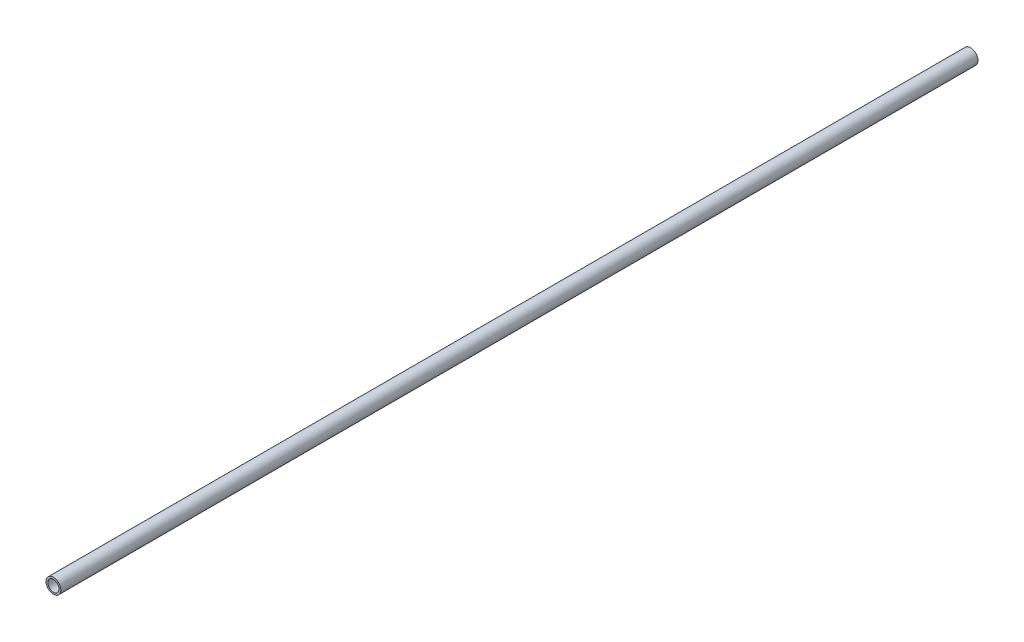
ISO-10303-21;
HEADER;
FILE_DESCRIPTION(('STEP AP214'),'2;1');
FILE_NAME('part.step','',(''),(''),'','','');
FILE_SCHEMA(('AUTOMOTIVE_DESIGN { 1 0 10303 214 1 1 1 1 }'));
ENDSEC;
DATA;
#1=APPLICATION_CONTEXT('core data for automotive mechanical design processes');
#2=APPLICATION_PROTOCOL_DEFINITION('international standard','automotive_design',2000,#1);
#3=PRODUCT_CONTEXT('',#1,'mechanical');
#4=PRODUCT('Part','Part','',(#3));
#5=PRODUCT_RELATED_PRODUCT_CATEGORY('part','',(#4));
#6=PRODUCT_DEFINITION_FORMATION('','',#4);
#7=PRODUCT_DEFINITION_CONTEXT('part definition',#1,'design');
#8=PRODUCT_DEFINITION('design','',#6,#7);
#9=PRODUCT_DEFINITION_SHAPE('','',#8);
#10=(LENGTH_UNIT() NAMED_UNIT(*) SI_UNIT(.MILLI.,.METRE.));
#11=(NAMED_UNIT(*) PLANE_ANGLE_UNIT() SI_UNIT($,.RADIAN.));
#12=(NAMED_UNIT(*) SI_UNIT($,.STERADIAN.) SOLID_ANGLE_UNIT());
#13=UNCERTAINTY_MEASURE_WITH_UNIT(LENGTH_MEASURE(1.E-05),#10,'distance_accuracy_value','');
#14=(GEOMETRIC_REPRESENTATION_CONTEXT(3) GLOBAL_UNCERTAINTY_ASSIGNED_CONTEXT((#13)) GLOBAL_UNIT_ASSIGNED_CONTEXT((#10,
#11,#12)) REPRESENTATION_CONTEXT('',''));
#15=CARTESIAN_POINT('',(0.,0.,0.));
#16=DIRECTION('',(0.,0.,1.));
#17=DIRECTION('',(1.,0.,0.));
#18=AXIS2_PLACEMENT_3D('',#15,#16,#17);
#19=CARTESIAN_POINT('',(-6.8052618233913,9.03698539207017,247.65));
#20=DIRECTION('',(0.,0.,1.));
#21=DIRECTION('',(1.,0.,0.));
#22=AXIS2_PLACEMENT_3D('',#19,#20,#21);
#23=PLANE('',#22);
#24=CARTESIAN_POINT('',(-6.8052618233913,9.03698539207017,247.65));
#25=DIRECTION('',(0.,0.,1.));
#26=DIRECTION('',(1.,0.,0.));
#27=AXIS2_PLACEMENT_3D('',#24,#25,#26);
#28=CIRCLE('',#27,2.);
#29=CARTESIAN_POINT('',(-4.80526182339129,9.03698539207017,247.65));
#30=VERTEX_POINT('',#29);
#31=EDGE_CURVE('E10',#30,#30,#28,.T.);
#32=ORIENTED_EDGE('',*,*,#31,.T.);
#33=EDGE_LOOP('',(#32));
#34=FACE_BOUND('',#33,.T.);
#35=CARTESIAN_POINT('',(-6.8052618233913,9.03698539207017,247.65));
#36=DIRECTION('',(0.,0.,1.));
#37=DIRECTION('',(1.,0.,0.));
#38=AXIS2_PLACEMENT_3D('',#35,#36,#37);
#39=CIRCLE('',#38,1.5);
#40=CARTESIAN_POINT('',(-5.30526182339129,9.03698539207017,247.65));
#41=VERTEX_POINT('',#40);
#42=EDGE_CURVE('E50',#41,#41,#39,.T.);
#43=ORIENTED_EDGE('',*,*,#42,.F.);
#44=EDGE_LOOP('',(#43));
#45=FACE_BOUND('',#44,.T.);
#46=ADVANCED_FACE('F37',(#34,#45),#23,.T.);
#47=CARTESIAN_POINT('',(-6.8052618233913,9.03698539207017,0.));
#48=DIRECTION('',(0.,0.,1.));
#49=DIRECTION('',(1.,0.,0.));
#50=AXIS2_PLACEMENT_3D('',#47,#48,#49);
#51=PLANE('',#50);
#52=CARTESIAN_POINT('',(-6.8052618233913,9.03698539207017,0.));
#53=DIRECTION('',(0.,0.,1.));
#54=DIRECTION('',(1.,0.,0.));
#55=AXIS2_PLACEMENT_3D('',#52,#53,#54);
#56=CIRCLE('',#55,2.);
#57=CARTESIAN_POINT('',(-4.80526182339129,9.03698539207017,0.));
#58=VERTEX_POINT('',#57);
#59=EDGE_CURVE('E41',#58,#58,#56,.T.);
#60=ORIENTED_EDGE('',*,*,#59,.F.);
#61=EDGE_LOOP('',(#60));
#62=FACE_BOUND('',#61,.T.);
#63=CARTESIAN_POINT('',(-6.8052618233913,9.03698539207017,0.));
#64=DIRECTION('',(0.,0.,1.));
#65=DIRECTION('',(1.,0.,0.));
#66=AXIS2_PLACEMENT_3D('',#63,#64,#65);
#67=CIRCLE('',#66,1.5);
#68=CARTESIAN_POINT('',(-5.30526182339129,9.03698539207017,0.));
#69=VERTEX_POINT('',#68);
#70=EDGE_CURVE('E52',#69,#69,#67,.T.);
#71=ORIENTED_EDGE('',*,*,#70,.T.);
#72=EDGE_LOOP('',(#71));
#73=FACE_BOUND('',#72,.T.);
#74=ADVANCED_FACE('F64',(#62,#73),#51,.F.);
#75=CARTESIAN_POINT('',(-6.8052618233913,9.03698539207017,247.65));
#76=DIRECTION('',(0.,0.,-1.));
#77=DIRECTION('',(-1.,0.,0.));
#78=AXIS2_PLACEMENT_3D('',#75,#76,#77);
#79=CYLINDRICAL_SURFACE('',#78,2.);
#80=ORIENTED_EDGE('',*,*,#31,.F.);
#81=EDGE_LOOP('',(#80));
#82=FACE_BOUND('',#81,.T.);
#83=ORIENTED_EDGE('',*,*,#59,.T.);
#84=EDGE_LOOP('',(#83));
#85=FACE_BOUND('',#84,.T.);
#86=ADVANCED_FACE('F39',(#82,#85),#79,.T.);
#87=CARTESIAN_POINT('',(-6.8052618233913,9.03698539207017,247.65));
#88=DIRECTION('',(0.,0.,-1.));
#89=DIRECTION('',(-1.,0.,0.));
#90=AXIS2_PLACEMENT_3D('',#87,#88,#89);
#91=CYLINDRICAL_SURFACE('',#90,1.5);
#92=ORIENTED_EDGE('',*,*,#42,.T.);
#93=EDGE_LOOP('',(#92));
#94=FACE_BOUND('',#93,.T.);
#95=ORIENTED_EDGE('',*,*,#70,.F.);
#96=EDGE_LOOP('',(#95));
#97=FACE_BOUND('',#96,.T.);
#98=ADVANCED_FACE('F60',(#94,#97),#91,.F.);
#99=CLOSED_SHELL('',(#46,#74,#86,#98));
#100=MANIFOLD_SOLID_BREP('B2',#99);
#101=ADVANCED_BREP_SHAPE_REPRESENTATION('',(#18,#100),#14);
#102=SHAPE_DEFINITION_REPRESENTATION(#9,#101);
ENDSEC;
END-ISO-10303-21;
